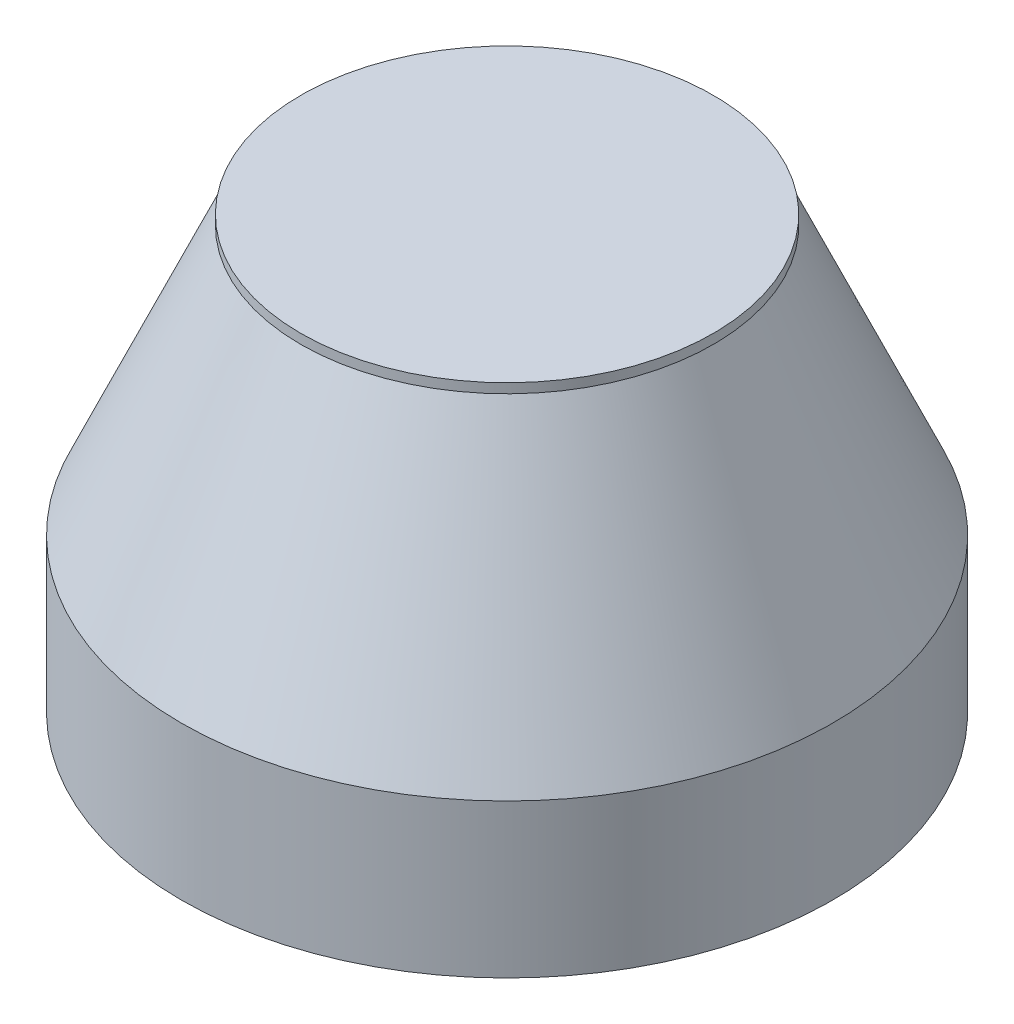
ISO-10303-21;
HEADER;
FILE_DESCRIPTION(('STEP AP214'),'2;1');
FILE_NAME('part.step','',(''),(''),'','','');
FILE_SCHEMA(('AUTOMOTIVE_DESIGN { 1 0 10303 214 1 1 1 1 }'));
ENDSEC;
DATA;
#1=APPLICATION_CONTEXT('core data for automotive mechanical design processes');
#2=APPLICATION_PROTOCOL_DEFINITION('international standard','automotive_design',2000,#1);
#3=PRODUCT_CONTEXT('',#1,'mechanical');
#4=PRODUCT('Part','Part','',(#3));
#5=PRODUCT_RELATED_PRODUCT_CATEGORY('part','',(#4));
#6=PRODUCT_DEFINITION_FORMATION('','',#4);
#7=PRODUCT_DEFINITION_CONTEXT('part definition',#1,'design');
#8=PRODUCT_DEFINITION('design','',#6,#7);
#9=PRODUCT_DEFINITION_SHAPE('','',#8);
#10=(LENGTH_UNIT() NAMED_UNIT(*) SI_UNIT(.MILLI.,.METRE.));
#11=(NAMED_UNIT(*) PLANE_ANGLE_UNIT() SI_UNIT($,.RADIAN.));
#12=(NAMED_UNIT(*) SI_UNIT($,.STERADIAN.) SOLID_ANGLE_UNIT());
#13=UNCERTAINTY_MEASURE_WITH_UNIT(LENGTH_MEASURE(1.E-05),#10,'distance_accuracy_value','');
#14=(GEOMETRIC_REPRESENTATION_CONTEXT(3) GLOBAL_UNCERTAINTY_ASSIGNED_CONTEXT((#13)) GLOBAL_UNIT_ASSIGNED_CONTEXT((#10,
#11,#12)) REPRESENTATION_CONTEXT('',''));
#15=CARTESIAN_POINT('',(0.,0.,0.));
#16=DIRECTION('',(0.,0.,1.));
#17=DIRECTION('',(1.,0.,0.));
#18=AXIS2_PLACEMENT_3D('',#15,#16,#17);
#19=CARTESIAN_POINT('',(0.,8.,0.));
#20=DIRECTION('',(0.,-1.,0.));
#21=DIRECTION('',(0.,0.,-1.));
#22=AXIS2_PLACEMENT_3D('',#19,#20,#21);
#23=CYLINDRICAL_SURFACE('',#22,17.);
#24=CARTESIAN_POINT('',(0.,8.,0.));
#25=DIRECTION('',(0.,1.,0.));
#26=DIRECTION('',(0.,0.,1.));
#27=AXIS2_PLACEMENT_3D('',#24,#25,#26);
#28=CIRCLE('',#27,17.);
#29=CARTESIAN_POINT('',(0.,8.,17.));
#30=VERTEX_POINT('',#29);
#31=EDGE_CURVE('E10',#30,#30,#28,.T.);
#32=ORIENTED_EDGE('',*,*,#31,.F.);
#33=EDGE_LOOP('',(#32));
#34=FACE_BOUND('',#33,.T.);
#35=CARTESIAN_POINT('',(0.,0.,0.));
#36=DIRECTION('',(0.,1.,0.));
#37=DIRECTION('',(0.,0.,1.));
#38=AXIS2_PLACEMENT_3D('',#35,#36,#37);
#39=CIRCLE('',#38,17.);
#40=CARTESIAN_POINT('',(0.,0.,17.));
#41=VERTEX_POINT('',#40);
#42=EDGE_CURVE('E42',#41,#41,#39,.T.);
#43=ORIENTED_EDGE('',*,*,#42,.T.);
#44=EDGE_LOOP('',(#43));
#45=FACE_BOUND('',#44,.T.);
#46=ADVANCED_FACE('F39',(#34,#45),#23,.T.);
#47=CARTESIAN_POINT('',(0.,0.,0.));
#48=DIRECTION('',(0.,1.,0.));
#49=DIRECTION('',(0.,0.,1.));
#50=AXIS2_PLACEMENT_3D('',#47,#48,#49);
#51=PLANE('',#50);
#52=ORIENTED_EDGE('',*,*,#42,.F.);
#53=EDGE_LOOP('',(#52));
#54=FACE_BOUND('',#53,.T.);
#55=ADVANCED_FACE('F71',(#54),#51,.F.);
#56=CARTESIAN_POINT('',(0.,8.,0.));
#57=DIRECTION('',(0.,-1.,0.));
#58=DIRECTION('',(0.,0.,1.));
#59=AXIS2_PLACEMENT_3D('',#56,#57,#58);
#60=CONICAL_SURFACE('',#59,17.,0.41887902047864);
#61=CARTESIAN_POINT('',(0.,22.,0.));
#62=DIRECTION('',(0.,1.,0.));
#63=DIRECTION('',(0.,0.,1.));
#64=AXIS2_PLACEMENT_3D('',#61,#62,#63);
#65=CIRCLE('',#64,10.7667984056805);
#66=CARTESIAN_POINT('',(0.,22.,10.7667984056805));
#67=VERTEX_POINT('',#66);
#68=EDGE_CURVE('E51',#67,#67,#65,.T.);
#69=ORIENTED_EDGE('',*,*,#68,.F.);
#70=EDGE_LOOP('',(#69));
#71=FACE_BOUND('',#70,.T.);
#72=ORIENTED_EDGE('',*,*,#31,.T.);
#73=EDGE_LOOP('',(#72));
#74=FACE_BOUND('',#73,.T.);
#75=ADVANCED_FACE('F66',(#71,#74),#60,.T.);
#76=CARTESIAN_POINT('',(0.,22.5,0.));
#77=DIRECTION('',(0.,-1.,0.));
#78=DIRECTION('',(0.,0.,-1.));
#79=AXIS2_PLACEMENT_3D('',#76,#77,#78);
#80=CYLINDRICAL_SURFACE('',#79,10.7667984056805);
#81=CARTESIAN_POINT('',(0.,22.5,0.));
#82=DIRECTION('',(0.,1.,0.));
#83=DIRECTION('',(0.,0.,1.));
#84=AXIS2_PLACEMENT_3D('',#81,#82,#83);
#85=CIRCLE('',#84,10.7667984056805);
#86=CARTESIAN_POINT('',(0.,22.5,10.7667984056805));
#87=VERTEX_POINT('',#86);
#88=EDGE_CURVE('E56',#87,#87,#85,.T.);
#89=ORIENTED_EDGE('',*,*,#88,.F.);
#90=EDGE_LOOP('',(#89));
#91=FACE_BOUND('',#90,.T.);
#92=ORIENTED_EDGE('',*,*,#68,.T.);
#93=EDGE_LOOP('',(#92));
#94=FACE_BOUND('',#93,.T.);
#95=ADVANCED_FACE('F63',(#91,#94),#80,.T.);
#96=CARTESIAN_POINT('',(0.,22.5,0.));
#97=DIRECTION('',(0.,1.,0.));
#98=DIRECTION('',(0.,0.,1.));
#99=AXIS2_PLACEMENT_3D('',#96,#97,#98);
#100=PLANE('',#99);
#101=ORIENTED_EDGE('',*,*,#88,.T.);
#102=EDGE_LOOP('',(#101));
#103=FACE_BOUND('',#102,.T.);
#104=ADVANCED_FACE('F61',(#103),#100,.T.);
#105=CLOSED_SHELL('',(#46,#55,#75,#95,#104));
#106=MANIFOLD_SOLID_BREP('B2',#105);
#107=ADVANCED_BREP_SHAPE_REPRESENTATION('',(#18,#106),#14);
#108=SHAPE_DEFINITION_REPRESENTATION(#9,#107);
ENDSEC;
END-ISO-10303-21;
